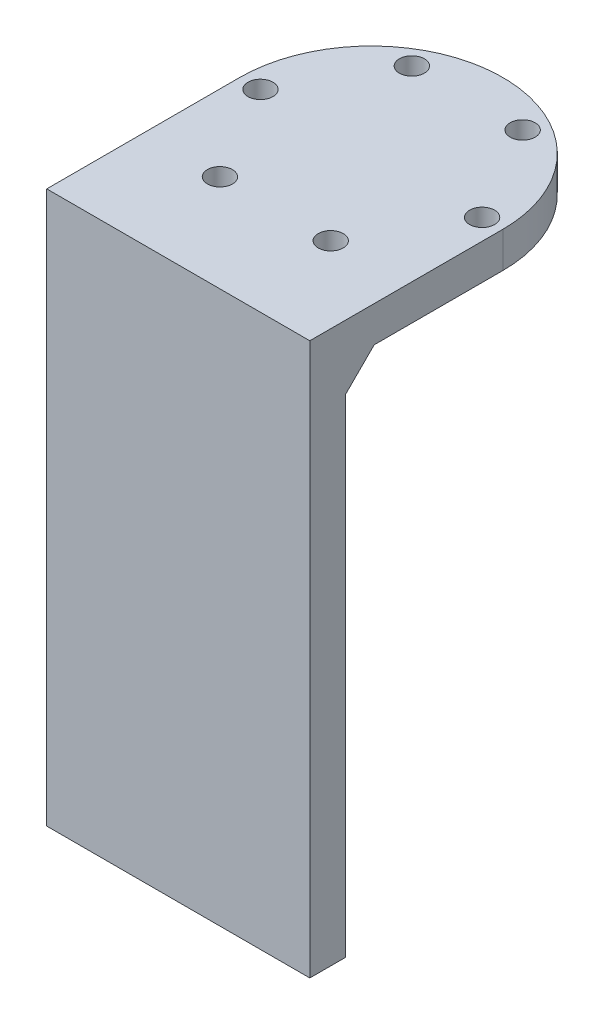
ISO-10303-21;
HEADER;
FILE_DESCRIPTION(('STEP AP214'),'2;1');
FILE_NAME('part.step','',(''),(''),'','','');
FILE_SCHEMA(('AUTOMOTIVE_DESIGN { 1 0 10303 214 1 1 1 1 }'));
ENDSEC;
DATA;
#1=APPLICATION_CONTEXT('core data for automotive mechanical design processes');
#2=APPLICATION_PROTOCOL_DEFINITION('international standard','automotive_design',2000,#1);
#3=PRODUCT_CONTEXT('',#1,'mechanical');
#4=PRODUCT('Part','Part','',(#3));
#5=PRODUCT_RELATED_PRODUCT_CATEGORY('part','',(#4));
#6=PRODUCT_DEFINITION_FORMATION('','',#4);
#7=PRODUCT_DEFINITION_CONTEXT('part definition',#1,'design');
#8=PRODUCT_DEFINITION('design','',#6,#7);
#9=PRODUCT_DEFINITION_SHAPE('','',#8);
#10=(LENGTH_UNIT() NAMED_UNIT(*) SI_UNIT(.MILLI.,.METRE.));
#11=(NAMED_UNIT(*) PLANE_ANGLE_UNIT() SI_UNIT($,.RADIAN.));
#12=(NAMED_UNIT(*) SI_UNIT($,.STERADIAN.) SOLID_ANGLE_UNIT());
#13=UNCERTAINTY_MEASURE_WITH_UNIT(LENGTH_MEASURE(1.E-05),#10,'distance_accuracy_value','');
#14=(GEOMETRIC_REPRESENTATION_CONTEXT(3) GLOBAL_UNCERTAINTY_ASSIGNED_CONTEXT((#13)) GLOBAL_UNIT_ASSIGNED_CONTEXT((#10,
#11,#12)) REPRESENTATION_CONTEXT('',''));
#15=CARTESIAN_POINT('',(0.,0.,0.));
#16=DIRECTION('',(0.,0.,1.));
#17=DIRECTION('',(1.,0.,0.));
#18=AXIS2_PLACEMENT_3D('',#15,#16,#17);
#19=CARTESIAN_POINT('',(58.144383929569,32.5291982571184,589.406662222502));
#20=DIRECTION('',(0.,-1.,0.));
#21=DIRECTION('',(0.,0.,-1.));
#22=AXIS2_PLACEMENT_3D('',#19,#20,#21);
#23=PLANE('',#22);
#24=DIRECTION('',(0.,0.,1.));
#25=VECTOR('',#24,1.);
#26=CARTESIAN_POINT('',(76.5443839295697,32.5291982571184,589.406662222502));
#27=LINE('',#26,#25);
#28=CARTESIAN_POINT('',(76.5443839295697,32.5291982571184,589.406662222502));
#29=VERTEX_POINT('',#28);
#30=CARTESIAN_POINT('',(76.5443839295697,32.5291982571184,607.406662222502));
#31=VERTEX_POINT('',#30);
#32=EDGE_CURVE('E167',#29,#31,#27,.T.);
#33=ORIENTED_EDGE('',*,*,#32,.T.);
#34=DIRECTION('',(-1.,0.,0.));
#35=VECTOR('',#34,1.);
#36=CARTESIAN_POINT('',(58.144383929569,32.5291982571184,607.406662222502));
#37=LINE('',#36,#35);
#38=CARTESIAN_POINT('',(39.7443839295697,32.5291982571184,607.406662222502));
#39=VERTEX_POINT('',#38);
#40=EDGE_CURVE('E63',#31,#39,#37,.T.);
#41=ORIENTED_EDGE('',*,*,#40,.T.);
#42=DIRECTION('',(0.,0.,-1.));
#43=VECTOR('',#42,1.);
#44=CARTESIAN_POINT('',(39.7443839295697,32.5291982571184,589.406662222502));
#45=LINE('',#44,#43);
#46=CARTESIAN_POINT('',(39.7443839295697,32.5291982571184,589.406662222502));
#47=VERTEX_POINT('',#46);
#48=EDGE_CURVE('E170',#39,#47,#45,.T.);
#49=ORIENTED_EDGE('',*,*,#48,.T.);
#50=CARTESIAN_POINT('',(58.144383929569,32.5291982571184,589.406662222502));
#51=DIRECTION('',(0.,-1.,0.));
#52=DIRECTION('',(0.,0.,-1.));
#53=AXIS2_PLACEMENT_3D('',#50,#51,#52);
#54=CIRCLE('',#53,18.4);
#55=EDGE_CURVE('E164',#47,#29,#54,.T.);
#56=ORIENTED_EDGE('',*,*,#55,.T.);
#57=EDGE_LOOP('',(#33,#41,#49,#56));
#58=FACE_BOUND('',#57,.T.);
#59=CARTESIAN_POINT('',(50.3943839295697,32.5291982571184,602.830055981161));
#60=DIRECTION('',(0.,-1.,0.));
#61=DIRECTION('',(0.,0.,-1.));
#62=AXIS2_PLACEMENT_3D('',#59,#60,#61);
#63=CIRCLE('',#62,1.74999999999993);
#64=CARTESIAN_POINT('',(50.3943839295697,32.5291982571184,601.080055981161));
#65=VERTEX_POINT('',#64);
#66=EDGE_CURVE('E134',#65,#65,#63,.T.);
#67=ORIENTED_EDGE('',*,*,#66,.F.);
#68=EDGE_LOOP('',(#67));
#69=FACE_BOUND('',#68,.T.);
#70=CARTESIAN_POINT('',(73.6443839295696,32.5291982571184,589.406662222502));
#71=DIRECTION('',(0.,-1.,0.));
#72=DIRECTION('',(0.,0.,-1.));
#73=AXIS2_PLACEMENT_3D('',#70,#71,#72);
#74=CIRCLE('',#73,1.74999999999994);
#75=CARTESIAN_POINT('',(73.6443839295696,32.5291982571184,587.656662222502));
#76=VERTEX_POINT('',#75);
#77=EDGE_CURVE('E146',#76,#76,#74,.T.);
#78=ORIENTED_EDGE('',*,*,#77,.F.);
#79=EDGE_LOOP('',(#78));
#80=FACE_BOUND('',#79,.T.);
#81=CARTESIAN_POINT('',(50.3943839295697,32.5291982571184,575.983268463843));
#82=DIRECTION('',(0.,-1.,0.));
#83=DIRECTION('',(0.,0.,-1.));
#84=AXIS2_PLACEMENT_3D('',#81,#82,#83);
#85=CIRCLE('',#84,1.75000000000007);
#86=CARTESIAN_POINT('',(50.3943839295697,32.5291982571184,574.233268463843));
#87=VERTEX_POINT('',#86);
#88=EDGE_CURVE('E158',#87,#87,#85,.T.);
#89=ORIENTED_EDGE('',*,*,#88,.F.);
#90=EDGE_LOOP('',(#89));
#91=FACE_BOUND('',#90,.T.);
#92=CARTESIAN_POINT('',(65.8943839295695,32.5291982571184,575.983268463843));
#93=DIRECTION('',(0.,-1.,0.));
#94=DIRECTION('',(0.,0.,-1.));
#95=AXIS2_PLACEMENT_3D('',#92,#93,#94);
#96=CIRCLE('',#95,1.74999999999994);
#97=CARTESIAN_POINT('',(65.8943839295695,32.5291982571184,574.233268463843));
#98=VERTEX_POINT('',#97);
#99=EDGE_CURVE('E152',#98,#98,#96,.T.);
#100=ORIENTED_EDGE('',*,*,#99,.F.);
#101=EDGE_LOOP('',(#100));
#102=FACE_BOUND('',#101,.T.);
#103=CARTESIAN_POINT('',(65.8943839295697,32.5291982571184,602.830055981161));
#104=DIRECTION('',(0.,-1.,0.));
#105=DIRECTION('',(0.,0.,-1.));
#106=AXIS2_PLACEMENT_3D('',#103,#104,#105);
#107=CIRCLE('',#106,1.75000000000007);
#108=CARTESIAN_POINT('',(65.8943839295697,32.5291982571184,601.080055981161));
#109=VERTEX_POINT('',#108);
#110=EDGE_CURVE('E140',#109,#109,#107,.T.);
#111=ORIENTED_EDGE('',*,*,#110,.F.);
#112=EDGE_LOOP('',(#111));
#113=FACE_BOUND('',#112,.T.);
#114=CARTESIAN_POINT('',(42.6443839295697,32.5291982571184,589.406662222502));
#115=DIRECTION('',(0.,-1.,0.));
#116=DIRECTION('',(0.,0.,-1.));
#117=AXIS2_PLACEMENT_3D('',#114,#115,#116);
#118=CIRCLE('',#117,1.74999999999995);
#119=CARTESIAN_POINT('',(42.6443839295697,32.5291982571184,587.656662222502));
#120=VERTEX_POINT('',#119);
#121=EDGE_CURVE('E126',#120,#120,#118,.T.);
#122=ORIENTED_EDGE('',*,*,#121,.F.);
#123=EDGE_LOOP('',(#122));
#124=FACE_BOUND('',#123,.T.);
#125=ADVANCED_FACE('F41',(#58,#69,#80,#91,#102,#113,#124),#23,.T.);
#126=CARTESIAN_POINT('',(58.144383929569,37.5291982571184,589.406662222502));
#127=DIRECTION('',(0.,-1.,0.));
#128=DIRECTION('',(0.,0.,-1.));
#129=AXIS2_PLACEMENT_3D('',#126,#127,#128);
#130=PLANE('',#129);
#131=CARTESIAN_POINT('',(58.144383929569,37.5291982571184,589.406662222502));
#132=DIRECTION('',(0.,-1.,0.));
#133=DIRECTION('',(0.,0.,-1.));
#134=AXIS2_PLACEMENT_3D('',#131,#132,#133);
#135=CIRCLE('',#134,18.4);
#136=CARTESIAN_POINT('',(39.7443839295697,37.5291982571184,589.406662222502));
#137=VERTEX_POINT('',#136);
#138=CARTESIAN_POINT('',(76.5443839295697,37.5291982571184,589.406662222502));
#139=VERTEX_POINT('',#138);
#140=EDGE_CURVE('E161',#137,#139,#135,.T.);
#141=ORIENTED_EDGE('',*,*,#140,.F.);
#142=DIRECTION('',(0.,0.,-1.));
#143=VECTOR('',#142,1.);
#144=CARTESIAN_POINT('',(39.7443839295697,37.5291982571184,589.406662222502));
#145=LINE('',#144,#143);
#146=CARTESIAN_POINT('',(39.7443839295697,37.5291982571184,616.406662222502));
#147=VERTEX_POINT('',#146);
#148=EDGE_CURVE('E168',#147,#137,#145,.T.);
#149=ORIENTED_EDGE('',*,*,#148,.F.);
#150=DIRECTION('',(-1.,0.,0.));
#151=VECTOR('',#150,1.);
#152=CARTESIAN_POINT('',(76.5443839295697,37.5291982571184,616.406662222502));
#153=LINE('',#152,#151);
#154=CARTESIAN_POINT('',(76.5443839295697,37.5291982571184,616.406662222502));
#155=VERTEX_POINT('',#154);
#156=EDGE_CURVE('E177',#155,#147,#153,.T.);
#157=ORIENTED_EDGE('',*,*,#156,.F.);
#158=DIRECTION('',(0.,0.,1.));
#159=VECTOR('',#158,1.);
#160=CARTESIAN_POINT('',(76.5443839295697,37.5291982571184,589.406662222502));
#161=LINE('',#160,#159);
#162=EDGE_CURVE('E175',#139,#155,#161,.T.);
#163=ORIENTED_EDGE('',*,*,#162,.F.);
#164=EDGE_LOOP('',(#141,#149,#157,#163));
#165=FACE_BOUND('',#164,.T.);
#166=CARTESIAN_POINT('',(50.3943839295697,37.5291982571184,575.983268463843));
#167=DIRECTION('',(0.,-1.,0.));
#168=DIRECTION('',(0.,0.,-1.));
#169=AXIS2_PLACEMENT_3D('',#166,#167,#168);
#170=CIRCLE('',#169,1.75000000000007);
#171=CARTESIAN_POINT('',(50.3943839295697,37.5291982571184,574.233268463843));
#172=VERTEX_POINT('',#171);
#173=EDGE_CURVE('E155',#172,#172,#170,.T.);
#174=ORIENTED_EDGE('',*,*,#173,.T.);
#175=EDGE_LOOP('',(#174));
#176=FACE_BOUND('',#175,.T.);
#177=CARTESIAN_POINT('',(65.8943839295695,37.5291982571184,575.983268463843));
#178=DIRECTION('',(0.,-1.,0.));
#179=DIRECTION('',(0.,0.,-1.));
#180=AXIS2_PLACEMENT_3D('',#177,#178,#179);
#181=CIRCLE('',#180,1.74999999999994);
#182=CARTESIAN_POINT('',(65.8943839295695,37.5291982571184,574.233268463843));
#183=VERTEX_POINT('',#182);
#184=EDGE_CURVE('E149',#183,#183,#181,.T.);
#185=ORIENTED_EDGE('',*,*,#184,.T.);
#186=EDGE_LOOP('',(#185));
#187=FACE_BOUND('',#186,.T.);
#188=CARTESIAN_POINT('',(73.6443839295696,37.5291982571184,589.406662222502));
#189=DIRECTION('',(0.,-1.,0.));
#190=DIRECTION('',(0.,0.,-1.));
#191=AXIS2_PLACEMENT_3D('',#188,#189,#190);
#192=CIRCLE('',#191,1.74999999999994);
#193=CARTESIAN_POINT('',(73.6443839295696,37.5291982571184,587.656662222502));
#194=VERTEX_POINT('',#193);
#195=EDGE_CURVE('E143',#194,#194,#192,.T.);
#196=ORIENTED_EDGE('',*,*,#195,.T.);
#197=EDGE_LOOP('',(#196));
#198=FACE_BOUND('',#197,.T.);
#199=CARTESIAN_POINT('',(65.8943839295697,37.5291982571184,602.830055981161));
#200=DIRECTION('',(0.,-1.,0.));
#201=DIRECTION('',(0.,0.,-1.));
#202=AXIS2_PLACEMENT_3D('',#199,#200,#201);
#203=CIRCLE('',#202,1.75000000000007);
#204=CARTESIAN_POINT('',(65.8943839295697,37.5291982571184,601.080055981161));
#205=VERTEX_POINT('',#204);
#206=EDGE_CURVE('E137',#205,#205,#203,.T.);
#207=ORIENTED_EDGE('',*,*,#206,.T.);
#208=EDGE_LOOP('',(#207));
#209=FACE_BOUND('',#208,.T.);
#210=CARTESIAN_POINT('',(50.3943839295697,37.5291982571184,602.830055981161));
#211=DIRECTION('',(0.,-1.,0.));
#212=DIRECTION('',(0.,0.,-1.));
#213=AXIS2_PLACEMENT_3D('',#210,#211,#212);
#214=CIRCLE('',#213,1.74999999999993);
#215=CARTESIAN_POINT('',(50.3943839295697,37.5291982571184,601.080055981161));
#216=VERTEX_POINT('',#215);
#217=EDGE_CURVE('E132',#216,#216,#214,.T.);
#218=ORIENTED_EDGE('',*,*,#217,.T.);
#219=EDGE_LOOP('',(#218));
#220=FACE_BOUND('',#219,.T.);
#221=CARTESIAN_POINT('',(42.6443839295697,37.5291982571184,589.406662222502));
#222=DIRECTION('',(0.,-1.,0.));
#223=DIRECTION('',(0.,0.,-1.));
#224=AXIS2_PLACEMENT_3D('',#221,#222,#223);
#225=CIRCLE('',#224,1.74999999999995);
#226=CARTESIAN_POINT('',(42.6443839295697,37.5291982571184,587.656662222502));
#227=VERTEX_POINT('',#226);
#228=EDGE_CURVE('E123',#227,#227,#225,.T.);
#229=ORIENTED_EDGE('',*,*,#228,.T.);
#230=EDGE_LOOP('',(#229));
#231=FACE_BOUND('',#230,.T.);
#232=ADVANCED_FACE('F202',(#165,#176,#187,#198,#209,#220,#231),#130,.F.);
#233=CARTESIAN_POINT('',(58.144383929569,32.5291982571184,589.406662222502));
#234=DIRECTION('',(0.,1.,0.));
#235=DIRECTION('',(0.,0.,1.));
#236=AXIS2_PLACEMENT_3D('',#233,#234,#235);
#237=CYLINDRICAL_SURFACE('',#236,18.4);
#238=ORIENTED_EDGE('',*,*,#140,.T.);
#239=DIRECTION('',(0.,1.,0.));
#240=VECTOR('',#239,1.);
#241=CARTESIAN_POINT('',(76.5443839295697,32.5291982571184,589.406662222502));
#242=LINE('',#241,#240);
#243=EDGE_CURVE('E187',#29,#139,#242,.T.);
#244=ORIENTED_EDGE('',*,*,#243,.F.);
#245=ORIENTED_EDGE('',*,*,#55,.F.);
#246=DIRECTION('',(0.,1.,0.));
#247=VECTOR('',#246,1.);
#248=CARTESIAN_POINT('',(39.7443839295697,32.5291982571184,589.406662222502));
#249=LINE('',#248,#247);
#250=EDGE_CURVE('E172',#47,#137,#249,.T.);
#251=ORIENTED_EDGE('',*,*,#250,.T.);
#252=EDGE_LOOP('',(#238,#244,#245,#251));
#253=FACE_BOUND('',#252,.T.);
#254=ADVANCED_FACE('F206',(#253),#237,.T.);
#255=CARTESIAN_POINT('',(76.5443839295697,32.5291982571184,589.406662222502));
#256=DIRECTION('',(-1.,0.,0.));
#257=DIRECTION('',(0.,-1.,0.));
#258=AXIS2_PLACEMENT_3D('',#255,#256,#257);
#259=PLANE('',#258);
#260=ORIENTED_EDGE('',*,*,#162,.T.);
#261=DIRECTION('',(0.,1.,0.));
#262=VECTOR('',#261,1.);
#263=CARTESIAN_POINT('',(76.5443839295697,32.5291982571184,616.406662222502));
#264=LINE('',#263,#262);
#265=CARTESIAN_POINT('',(76.5443839295696,-39.6708017428816,616.406662222502));
#266=VERTEX_POINT('',#265);
#267=EDGE_CURVE('E184',#266,#155,#264,.T.);
#268=ORIENTED_EDGE('',*,*,#267,.F.);
#269=DIRECTION('',(0.,0.,1.));
#270=VECTOR('',#269,1.);
#271=CARTESIAN_POINT('',(76.5443839295696,-39.6708017428816,616.406662222502));
#272=LINE('',#271,#270);
#273=CARTESIAN_POINT('',(76.5443839295696,-39.6708017428816,611.406662222502));
#274=VERTEX_POINT('',#273);
#275=EDGE_CURVE('E110',#274,#266,#272,.T.);
#276=ORIENTED_EDGE('',*,*,#275,.F.);
#277=DIRECTION('',(0.,1.,0.));
#278=VECTOR('',#277,1.);
#279=CARTESIAN_POINT('',(76.5443839295696,-39.6708017428816,611.406662222502));
#280=LINE('',#279,#278);
#281=CARTESIAN_POINT('',(76.5443839295697,28.5291982571184,611.406662222502));
#282=VERTEX_POINT('',#281);
#283=EDGE_CURVE('E106',#274,#282,#280,.T.);
#284=ORIENTED_EDGE('',*,*,#283,.T.);
#285=DIRECTION('',(0.,0.707106781186551,-0.707106781186544));
#286=VECTOR('',#285,1.);
#287=CARTESIAN_POINT('',(76.5443839295697,41.5291982571184,598.406662222502));
#288=LINE('',#287,#286);
#289=EDGE_CURVE('E50',#282,#31,#288,.T.);
#290=ORIENTED_EDGE('',*,*,#289,.T.);
#291=ORIENTED_EDGE('',*,*,#32,.F.);
#292=ORIENTED_EDGE('',*,*,#243,.T.);
#293=EDGE_LOOP('',(#260,#268,#276,#284,#290,#291,#292));
#294=FACE_BOUND('',#293,.T.);
#295=ADVANCED_FACE('F193',(#294),#259,.F.);
#296=CARTESIAN_POINT('',(76.5443839295697,32.5291982571184,616.406662222502));
#297=DIRECTION('',(0.,0.,-1.));
#298=DIRECTION('',(0.,1.,0.));
#299=AXIS2_PLACEMENT_3D('',#296,#297,#298);
#300=PLANE('',#299);
#301=ORIENTED_EDGE('',*,*,#156,.T.);
#302=DIRECTION('',(0.,1.,0.));
#303=VECTOR('',#302,1.);
#304=CARTESIAN_POINT('',(39.7443839295697,32.5291982571184,616.406662222502));
#305=LINE('',#304,#303);
#306=CARTESIAN_POINT('',(39.7443839295697,-39.6708017428816,616.406662222502));
#307=VERTEX_POINT('',#306);
#308=EDGE_CURVE('E182',#307,#147,#305,.T.);
#309=ORIENTED_EDGE('',*,*,#308,.F.);
#310=DIRECTION('',(-1.,0.,0.));
#311=VECTOR('',#310,1.);
#312=CARTESIAN_POINT('',(39.7443839295697,-39.6708017428816,616.406662222502));
#313=LINE('',#312,#311);
#314=EDGE_CURVE('E117',#266,#307,#313,.T.);
#315=ORIENTED_EDGE('',*,*,#314,.F.);
#316=ORIENTED_EDGE('',*,*,#267,.T.);
#317=EDGE_LOOP('',(#301,#309,#315,#316));
#318=FACE_BOUND('',#317,.T.);
#319=ADVANCED_FACE('F196',(#318),#300,.F.);
#320=CARTESIAN_POINT('',(39.7443839295697,32.5291982571184,589.406662222502));
#321=DIRECTION('',(1.,0.,0.));
#322=DIRECTION('',(0.,1.,0.));
#323=AXIS2_PLACEMENT_3D('',#320,#321,#322);
#324=PLANE('',#323);
#325=ORIENTED_EDGE('',*,*,#148,.T.);
#326=ORIENTED_EDGE('',*,*,#250,.F.);
#327=ORIENTED_EDGE('',*,*,#48,.F.);
#328=DIRECTION('',(0.,-0.707106781186551,0.707106781186544));
#329=VECTOR('',#328,1.);
#330=CARTESIAN_POINT('',(39.7443839295697,41.5291982571184,598.406662222502));
#331=LINE('',#330,#329);
#332=CARTESIAN_POINT('',(39.7443839295697,28.5291982571184,611.406662222502));
#333=VERTEX_POINT('',#332);
#334=EDGE_CURVE('E11',#39,#333,#331,.T.);
#335=ORIENTED_EDGE('',*,*,#334,.T.);
#336=DIRECTION('',(0.,1.,0.));
#337=VECTOR('',#336,1.);
#338=CARTESIAN_POINT('',(39.7443839295697,-39.6708017428816,611.406662222502));
#339=LINE('',#338,#337);
#340=CARTESIAN_POINT('',(39.7443839295697,-39.6708017428816,611.406662222502));
#341=VERTEX_POINT('',#340);
#342=EDGE_CURVE('E104',#341,#333,#339,.T.);
#343=ORIENTED_EDGE('',*,*,#342,.F.);
#344=DIRECTION('',(0.,0.,-1.));
#345=VECTOR('',#344,1.);
#346=CARTESIAN_POINT('',(39.7443839295697,-39.6708017428816,616.406662222502));
#347=LINE('',#346,#345);
#348=EDGE_CURVE('E111',#307,#341,#347,.T.);
#349=ORIENTED_EDGE('',*,*,#348,.F.);
#350=ORIENTED_EDGE('',*,*,#308,.T.);
#351=EDGE_LOOP('',(#325,#326,#327,#335,#343,#349,#350));
#352=FACE_BOUND('',#351,.T.);
#353=ADVANCED_FACE('F121',(#352),#324,.F.);
#354=CARTESIAN_POINT('',(50.3943839295697,32.5291982571184,575.983268463843));
#355=DIRECTION('',(0.,1.,0.));
#356=DIRECTION('',(0.,0.,1.));
#357=AXIS2_PLACEMENT_3D('',#354,#355,#356);
#358=CYLINDRICAL_SURFACE('',#357,1.75000000000007);
#359=ORIENTED_EDGE('',*,*,#88,.T.);
#360=EDGE_LOOP('',(#359));
#361=FACE_BOUND('',#360,.T.);
#362=ORIENTED_EDGE('',*,*,#173,.F.);
#363=EDGE_LOOP('',(#362));
#364=FACE_BOUND('',#363,.T.);
#365=ADVANCED_FACE('F223',(#361,#364),#358,.F.);
#366=CARTESIAN_POINT('',(65.8943839295695,32.5291982571184,575.983268463843));
#367=DIRECTION('',(0.,1.,0.));
#368=DIRECTION('',(0.,0.,1.));
#369=AXIS2_PLACEMENT_3D('',#366,#367,#368);
#370=CYLINDRICAL_SURFACE('',#369,1.74999999999994);
#371=ORIENTED_EDGE('',*,*,#99,.T.);
#372=EDGE_LOOP('',(#371));
#373=FACE_BOUND('',#372,.T.);
#374=ORIENTED_EDGE('',*,*,#184,.F.);
#375=EDGE_LOOP('',(#374));
#376=FACE_BOUND('',#375,.T.);
#377=ADVANCED_FACE('F243',(#373,#376),#370,.F.);
#378=CARTESIAN_POINT('',(73.6443839295696,32.5291982571184,589.406662222502));
#379=DIRECTION('',(0.,1.,0.));
#380=DIRECTION('',(0.,0.,1.));
#381=AXIS2_PLACEMENT_3D('',#378,#379,#380);
#382=CYLINDRICAL_SURFACE('',#381,1.74999999999994);
#383=ORIENTED_EDGE('',*,*,#77,.T.);
#384=EDGE_LOOP('',(#383));
#385=FACE_BOUND('',#384,.T.);
#386=ORIENTED_EDGE('',*,*,#195,.F.);
#387=EDGE_LOOP('',(#386));
#388=FACE_BOUND('',#387,.T.);
#389=ADVANCED_FACE('F252',(#385,#388),#382,.F.);
#390=CARTESIAN_POINT('',(65.8943839295697,32.5291982571184,602.830055981161));
#391=DIRECTION('',(0.,1.,0.));
#392=DIRECTION('',(0.,0.,1.));
#393=AXIS2_PLACEMENT_3D('',#390,#391,#392);
#394=CYLINDRICAL_SURFACE('',#393,1.75000000000007);
#395=ORIENTED_EDGE('',*,*,#110,.T.);
#396=EDGE_LOOP('',(#395));
#397=FACE_BOUND('',#396,.T.);
#398=ORIENTED_EDGE('',*,*,#206,.F.);
#399=EDGE_LOOP('',(#398));
#400=FACE_BOUND('',#399,.T.);
#401=ADVANCED_FACE('F260',(#397,#400),#394,.F.);
#402=CARTESIAN_POINT('',(50.3943839295697,32.5291982571184,602.830055981161));
#403=DIRECTION('',(0.,1.,0.));
#404=DIRECTION('',(0.,0.,1.));
#405=AXIS2_PLACEMENT_3D('',#402,#403,#404);
#406=CYLINDRICAL_SURFACE('',#405,1.74999999999993);
#407=ORIENTED_EDGE('',*,*,#66,.T.);
#408=EDGE_LOOP('',(#407));
#409=FACE_BOUND('',#408,.T.);
#410=ORIENTED_EDGE('',*,*,#217,.F.);
#411=EDGE_LOOP('',(#410));
#412=FACE_BOUND('',#411,.T.);
#413=ADVANCED_FACE('F269',(#409,#412),#406,.F.);
#414=CARTESIAN_POINT('',(42.6443839295697,32.5291982571184,589.406662222502));
#415=DIRECTION('',(0.,1.,0.));
#416=DIRECTION('',(0.,0.,1.));
#417=AXIS2_PLACEMENT_3D('',#414,#415,#416);
#418=CYLINDRICAL_SURFACE('',#417,1.74999999999995);
#419=ORIENTED_EDGE('',*,*,#121,.T.);
#420=EDGE_LOOP('',(#419));
#421=FACE_BOUND('',#420,.T.);
#422=ORIENTED_EDGE('',*,*,#228,.F.);
#423=EDGE_LOOP('',(#422));
#424=FACE_BOUND('',#423,.T.);
#425=ADVANCED_FACE('F278',(#421,#424),#418,.F.);
#426=CARTESIAN_POINT('',(39.7443839295697,-39.6708017428816,611.406662222502));
#427=DIRECTION('',(0.,0.,1.));
#428=DIRECTION('',(0.,-1.,0.));
#429=AXIS2_PLACEMENT_3D('',#426,#427,#428);
#430=PLANE('',#429);
#431=ORIENTED_EDGE('',*,*,#342,.T.);
#432=DIRECTION('',(1.,0.,0.));
#433=VECTOR('',#432,1.);
#434=CARTESIAN_POINT('',(39.7443839295697,28.5291982571184,611.406662222502));
#435=LINE('',#434,#433);
#436=EDGE_CURVE('E190',#333,#282,#435,.T.);
#437=ORIENTED_EDGE('',*,*,#436,.T.);
#438=ORIENTED_EDGE('',*,*,#283,.F.);
#439=DIRECTION('',(1.,0.,0.));
#440=VECTOR('',#439,1.);
#441=CARTESIAN_POINT('',(39.7443839295697,-39.6708017428816,611.406662222502));
#442=LINE('',#441,#440);
#443=EDGE_CURVE('E99',#341,#274,#442,.T.);
#444=ORIENTED_EDGE('',*,*,#443,.F.);
#445=EDGE_LOOP('',(#431,#437,#438,#444));
#446=FACE_BOUND('',#445,.T.);
#447=ADVANCED_FACE('F101',(#446),#430,.F.);
#448=CARTESIAN_POINT('',(0.,-39.6708017428824,0.));
#449=DIRECTION('',(0.,-1.,0.));
#450=DIRECTION('',(0.,0.,-1.));
#451=AXIS2_PLACEMENT_3D('',#448,#449,#450);
#452=PLANE('',#451);
#453=ORIENTED_EDGE('',*,*,#348,.T.);
#454=ORIENTED_EDGE('',*,*,#443,.T.);
#455=ORIENTED_EDGE('',*,*,#275,.T.);
#456=ORIENTED_EDGE('',*,*,#314,.T.);
#457=EDGE_LOOP('',(#453,#454,#455,#456));
#458=FACE_BOUND('',#457,.T.);
#459=ADVANCED_FACE('F115',(#458),#452,.T.);
#460=CARTESIAN_POINT('',(39.7443839295697,28.5291982571184,611.406662222502));
#461=DIRECTION('',(0.,0.707106781186544,0.707106781186551));
#462=DIRECTION('',(1.,0.,0.));
#463=AXIS2_PLACEMENT_3D('',#460,#461,#462);
#464=PLANE('',#463);
#465=ORIENTED_EDGE('',*,*,#334,.F.);
#466=ORIENTED_EDGE('',*,*,#40,.F.);
#467=ORIENTED_EDGE('',*,*,#289,.F.);
#468=ORIENTED_EDGE('',*,*,#436,.F.);
#469=EDGE_LOOP('',(#465,#466,#467,#468));
#470=FACE_BOUND('',#469,.T.);
#471=ADVANCED_FACE('F44',(#470),#464,.F.);
#472=CLOSED_SHELL('',(#125,#232,#254,#295,#319,#353,#365,#377,#389,#401,#413,#425,#447,#459,#471));
#473=MANIFOLD_SOLID_BREP('B2',#472);
#474=ADVANCED_BREP_SHAPE_REPRESENTATION('',(#18,#473),#14);
#475=SHAPE_DEFINITION_REPRESENTATION(#9,#474);
ENDSEC;
END-ISO-10303-21;
